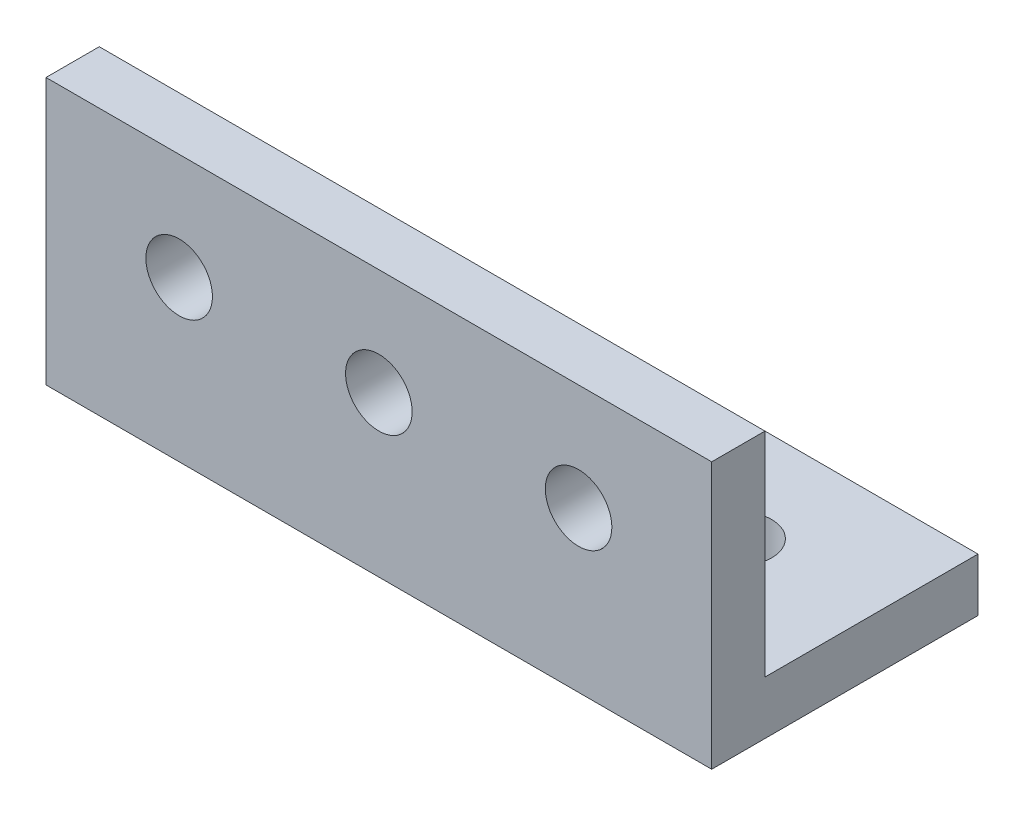
ISO-10303-21;
HEADER;
FILE_DESCRIPTION(('STEP AP214'),'2;1');
FILE_NAME('part.step','',(''),(''),'','','');
FILE_SCHEMA(('AUTOMOTIVE_DESIGN { 1 0 10303 214 1 1 1 1 }'));
ENDSEC;
DATA;
#1=APPLICATION_CONTEXT('core data for automotive mechanical design processes');
#2=APPLICATION_PROTOCOL_DEFINITION('international standard','automotive_design',2000,#1);
#3=PRODUCT_CONTEXT('',#1,'mechanical');
#4=PRODUCT('Part','Part','',(#3));
#5=PRODUCT_RELATED_PRODUCT_CATEGORY('part','',(#4));
#6=PRODUCT_DEFINITION_FORMATION('','',#4);
#7=PRODUCT_DEFINITION_CONTEXT('part definition',#1,'design');
#8=PRODUCT_DEFINITION('design','',#6,#7);
#9=PRODUCT_DEFINITION_SHAPE('','',#8);
#10=(LENGTH_UNIT() NAMED_UNIT(*) SI_UNIT(.MILLI.,.METRE.));
#11=(NAMED_UNIT(*) PLANE_ANGLE_UNIT() SI_UNIT($,.RADIAN.));
#12=(NAMED_UNIT(*) SI_UNIT($,.STERADIAN.) SOLID_ANGLE_UNIT());
#13=UNCERTAINTY_MEASURE_WITH_UNIT(LENGTH_MEASURE(1.E-05),#10,'distance_accuracy_value','');
#14=(GEOMETRIC_REPRESENTATION_CONTEXT(3) GLOBAL_UNCERTAINTY_ASSIGNED_CONTEXT((#13)) GLOBAL_UNIT_ASSIGNED_CONTEXT((#10,
#11,#12)) REPRESENTATION_CONTEXT('',''));
#15=CARTESIAN_POINT('',(0.,0.,0.));
#16=DIRECTION('',(0.,0.,1.));
#17=DIRECTION('',(1.,0.,0.));
#18=AXIS2_PLACEMENT_3D('',#15,#16,#17);
#19=CARTESIAN_POINT('',(0.,4.,0.));
#20=DIRECTION('',(0.,-1.,0.));
#21=DIRECTION('',(0.,0.,-1.));
#22=AXIS2_PLACEMENT_3D('',#19,#20,#21);
#23=PLANE('',#22);
#24=CARTESIAN_POINT('',(25.,4.,-12.));
#25=DIRECTION('',(0.,1.,0.));
#26=DIRECTION('',(0.,0.,1.));
#27=AXIS2_PLACEMENT_3D('',#24,#25,#26);
#28=CIRCLE('',#27,2.5);
#29=CARTESIAN_POINT('',(25.,4.,-9.5));
#30=VERTEX_POINT('',#29);
#31=EDGE_CURVE('E125',#30,#30,#28,.T.);
#32=ORIENTED_EDGE('',*,*,#31,.F.);
#33=EDGE_LOOP('',(#32));
#34=FACE_BOUND('',#33,.T.);
#35=CARTESIAN_POINT('',(40.,4.,-12.));
#36=DIRECTION('',(0.,1.,0.));
#37=DIRECTION('',(0.,0.,1.));
#38=AXIS2_PLACEMENT_3D('',#35,#36,#37);
#39=CIRCLE('',#38,2.5);
#40=CARTESIAN_POINT('',(40.,4.,-9.5));
#41=VERTEX_POINT('',#40);
#42=EDGE_CURVE('E120',#41,#41,#39,.T.);
#43=ORIENTED_EDGE('',*,*,#42,.F.);
#44=EDGE_LOOP('',(#43));
#45=FACE_BOUND('',#44,.T.);
#46=CARTESIAN_POINT('',(10.,4.,-12.));
#47=DIRECTION('',(0.,1.,0.));
#48=DIRECTION('',(0.,0.,1.));
#49=AXIS2_PLACEMENT_3D('',#46,#47,#48);
#50=CIRCLE('',#49,2.5);
#51=CARTESIAN_POINT('',(10.,4.,-9.5));
#52=VERTEX_POINT('',#51);
#53=EDGE_CURVE('E99',#52,#52,#50,.T.);
#54=ORIENTED_EDGE('',*,*,#53,.F.);
#55=EDGE_LOOP('',(#54));
#56=FACE_BOUND('',#55,.T.);
#57=DIRECTION('',(-1.,0.,0.));
#58=VECTOR('',#57,1.);
#59=CARTESIAN_POINT('',(0.,4.,-4.));
#60=LINE('',#59,#58);
#61=CARTESIAN_POINT('',(50.,4.,-4.));
#62=VERTEX_POINT('',#61);
#63=CARTESIAN_POINT('',(0.,4.,-4.));
#64=VERTEX_POINT('',#63);
#65=EDGE_CURVE('E52',#62,#64,#60,.T.);
#66=ORIENTED_EDGE('',*,*,#65,.F.);
#67=DIRECTION('',(0.,0.,-1.));
#68=VECTOR('',#67,1.);
#69=CARTESIAN_POINT('',(50.,4.,0.));
#70=LINE('',#69,#68);
#71=CARTESIAN_POINT('',(50.,4.,-20.));
#72=VERTEX_POINT('',#71);
#73=EDGE_CURVE('E114',#62,#72,#70,.T.);
#74=ORIENTED_EDGE('',*,*,#73,.T.);
#75=DIRECTION('',(-1.,0.,0.));
#76=VECTOR('',#75,1.);
#77=CARTESIAN_POINT('',(0.,4.,-20.));
#78=LINE('',#77,#76);
#79=CARTESIAN_POINT('',(0.,4.,-20.));
#80=VERTEX_POINT('',#79);
#81=EDGE_CURVE('E58',#72,#80,#78,.T.);
#82=ORIENTED_EDGE('',*,*,#81,.T.);
#83=DIRECTION('',(0.,0.,1.));
#84=VECTOR('',#83,1.);
#85=CARTESIAN_POINT('',(0.,4.,0.));
#86=LINE('',#85,#84);
#87=EDGE_CURVE('E87',#80,#64,#86,.T.);
#88=ORIENTED_EDGE('',*,*,#87,.T.);
#89=EDGE_LOOP('',(#66,#74,#82,#88));
#90=FACE_BOUND('',#89,.T.);
#91=ADVANCED_FACE('F35',(#34,#45,#56,#90),#23,.F.);
#92=CARTESIAN_POINT('',(0.,0.,0.));
#93=DIRECTION('',(0.,-1.,0.));
#94=DIRECTION('',(0.,0.,-1.));
#95=AXIS2_PLACEMENT_3D('',#92,#93,#94);
#96=PLANE('',#95);
#97=CARTESIAN_POINT('',(40.,0.,-12.));
#98=DIRECTION('',(0.,1.,0.));
#99=DIRECTION('',(0.,0.,1.));
#100=AXIS2_PLACEMENT_3D('',#97,#98,#99);
#101=CIRCLE('',#100,2.5);
#102=CARTESIAN_POINT('',(40.,0.,-9.5));
#103=VERTEX_POINT('',#102);
#104=EDGE_CURVE('E122',#103,#103,#101,.T.);
#105=ORIENTED_EDGE('',*,*,#104,.T.);
#106=EDGE_LOOP('',(#105));
#107=FACE_BOUND('',#106,.T.);
#108=DIRECTION('',(0.,0.,1.));
#109=VECTOR('',#108,1.);
#110=CARTESIAN_POINT('',(0.,0.,0.));
#111=LINE('',#110,#109);
#112=CARTESIAN_POINT('',(0.,0.,-20.));
#113=VERTEX_POINT('',#112);
#114=CARTESIAN_POINT('',(0.,0.,0.));
#115=VERTEX_POINT('',#114);
#116=EDGE_CURVE('E93',#113,#115,#111,.T.);
#117=ORIENTED_EDGE('',*,*,#116,.F.);
#118=DIRECTION('',(-1.,0.,0.));
#119=VECTOR('',#118,1.);
#120=CARTESIAN_POINT('',(0.,0.,-20.));
#121=LINE('',#120,#119);
#122=CARTESIAN_POINT('',(50.,0.,-20.));
#123=VERTEX_POINT('',#122);
#124=EDGE_CURVE('E77',#123,#113,#121,.T.);
#125=ORIENTED_EDGE('',*,*,#124,.F.);
#126=DIRECTION('',(0.,0.,-1.));
#127=VECTOR('',#126,1.);
#128=CARTESIAN_POINT('',(50.,0.,0.));
#129=LINE('',#128,#127);
#130=CARTESIAN_POINT('',(50.,0.,0.));
#131=VERTEX_POINT('',#130);
#132=EDGE_CURVE('E88',#131,#123,#129,.T.);
#133=ORIENTED_EDGE('',*,*,#132,.F.);
#134=DIRECTION('',(1.,0.,0.));
#135=VECTOR('',#134,1.);
#136=CARTESIAN_POINT('',(0.,0.,0.));
#137=LINE('',#136,#135);
#138=EDGE_CURVE('E98',#115,#131,#137,.T.);
#139=ORIENTED_EDGE('',*,*,#138,.F.);
#140=EDGE_LOOP('',(#117,#125,#133,#139));
#141=FACE_BOUND('',#140,.T.);
#142=CARTESIAN_POINT('',(10.,0.,-12.));
#143=DIRECTION('',(0.,1.,0.));
#144=DIRECTION('',(0.,0.,1.));
#145=AXIS2_PLACEMENT_3D('',#142,#143,#144);
#146=CIRCLE('',#145,2.5);
#147=CARTESIAN_POINT('',(10.,0.,-9.5));
#148=VERTEX_POINT('',#147);
#149=EDGE_CURVE('E103',#148,#148,#146,.T.);
#150=ORIENTED_EDGE('',*,*,#149,.T.);
#151=EDGE_LOOP('',(#150));
#152=FACE_BOUND('',#151,.T.);
#153=CARTESIAN_POINT('',(25.,0.,-12.));
#154=DIRECTION('',(0.,1.,0.));
#155=DIRECTION('',(0.,0.,1.));
#156=AXIS2_PLACEMENT_3D('',#153,#154,#155);
#157=CIRCLE('',#156,2.5);
#158=CARTESIAN_POINT('',(25.,0.,-9.5));
#159=VERTEX_POINT('',#158);
#160=EDGE_CURVE('E128',#159,#159,#157,.T.);
#161=ORIENTED_EDGE('',*,*,#160,.T.);
#162=EDGE_LOOP('',(#161));
#163=FACE_BOUND('',#162,.T.);
#164=ADVANCED_FACE('F96',(#107,#141,#152,#163),#96,.T.);
#165=CARTESIAN_POINT('',(0.,4.,0.));
#166=DIRECTION('',(1.,0.,0.));
#167=DIRECTION('',(0.,0.,-1.));
#168=AXIS2_PLACEMENT_3D('',#165,#166,#167);
#169=PLANE('',#168);
#170=ORIENTED_EDGE('',*,*,#116,.T.);
#171=DIRECTION('',(0.,-1.,0.));
#172=VECTOR('',#171,1.);
#173=CARTESIAN_POINT('',(0.,4.,0.));
#174=LINE('',#173,#172);
#175=CARTESIAN_POINT('',(0.,20.,0.));
#176=VERTEX_POINT('',#175);
#177=EDGE_CURVE('E11',#176,#115,#174,.T.);
#178=ORIENTED_EDGE('',*,*,#177,.F.);
#179=DIRECTION('',(0.,0.,1.));
#180=VECTOR('',#179,1.);
#181=CARTESIAN_POINT('',(0.,20.,0.));
#182=LINE('',#181,#180);
#183=CARTESIAN_POINT('',(0.,20.,-4.));
#184=VERTEX_POINT('',#183);
#185=EDGE_CURVE('E139',#184,#176,#182,.T.);
#186=ORIENTED_EDGE('',*,*,#185,.F.);
#187=DIRECTION('',(0.,-1.,0.));
#188=VECTOR('',#187,1.);
#189=CARTESIAN_POINT('',(0.,20.,-4.));
#190=LINE('',#189,#188);
#191=EDGE_CURVE('E141',#184,#64,#190,.T.);
#192=ORIENTED_EDGE('',*,*,#191,.T.);
#193=ORIENTED_EDGE('',*,*,#87,.F.);
#194=DIRECTION('',(0.,-1.,0.));
#195=VECTOR('',#194,1.);
#196=CARTESIAN_POINT('',(0.,4.,-20.));
#197=LINE('',#196,#195);
#198=EDGE_CURVE('E80',#80,#113,#197,.T.);
#199=ORIENTED_EDGE('',*,*,#198,.T.);
#200=EDGE_LOOP('',(#170,#178,#186,#192,#193,#199));
#201=FACE_BOUND('',#200,.T.);
#202=ADVANCED_FACE('F37',(#201),#169,.F.);
#203=CARTESIAN_POINT('',(0.,4.,0.));
#204=DIRECTION('',(0.,0.,-1.));
#205=DIRECTION('',(-1.,0.,0.));
#206=AXIS2_PLACEMENT_3D('',#203,#204,#205);
#207=PLANE('',#206);
#208=CARTESIAN_POINT('',(25.,12.,0.));
#209=DIRECTION('',(0.,0.,1.));
#210=DIRECTION('',(1.,0.,0.));
#211=AXIS2_PLACEMENT_3D('',#208,#209,#210);
#212=CIRCLE('',#211,2.5);
#213=CARTESIAN_POINT('',(27.5,12.,0.));
#214=VERTEX_POINT('',#213);
#215=EDGE_CURVE('E189',#214,#214,#212,.T.);
#216=ORIENTED_EDGE('',*,*,#215,.F.);
#217=EDGE_LOOP('',(#216));
#218=FACE_BOUND('',#217,.T.);
#219=CARTESIAN_POINT('',(40.,12.,0.));
#220=DIRECTION('',(0.,0.,1.));
#221=DIRECTION('',(1.,0.,0.));
#222=AXIS2_PLACEMENT_3D('',#219,#220,#221);
#223=CIRCLE('',#222,2.5);
#224=CARTESIAN_POINT('',(42.5,12.,0.));
#225=VERTEX_POINT('',#224);
#226=EDGE_CURVE('E183',#225,#225,#223,.T.);
#227=ORIENTED_EDGE('',*,*,#226,.F.);
#228=EDGE_LOOP('',(#227));
#229=FACE_BOUND('',#228,.T.);
#230=CARTESIAN_POINT('',(10.,12.,0.));
#231=DIRECTION('',(0.,0.,1.));
#232=DIRECTION('',(1.,0.,0.));
#233=AXIS2_PLACEMENT_3D('',#230,#231,#232);
#234=CIRCLE('',#233,2.5);
#235=CARTESIAN_POINT('',(12.5,12.,0.));
#236=VERTEX_POINT('',#235);
#237=EDGE_CURVE('E177',#236,#236,#234,.T.);
#238=ORIENTED_EDGE('',*,*,#237,.F.);
#239=EDGE_LOOP('',(#238));
#240=FACE_BOUND('',#239,.T.);
#241=ORIENTED_EDGE('',*,*,#138,.T.);
#242=DIRECTION('',(0.,-1.,0.));
#243=VECTOR('',#242,1.);
#244=CARTESIAN_POINT('',(50.,4.,0.));
#245=LINE('',#244,#243);
#246=CARTESIAN_POINT('',(50.,20.,0.));
#247=VERTEX_POINT('',#246);
#248=EDGE_CURVE('E44',#247,#131,#245,.T.);
#249=ORIENTED_EDGE('',*,*,#248,.F.);
#250=DIRECTION('',(1.,0.,0.));
#251=VECTOR('',#250,1.);
#252=CARTESIAN_POINT('',(0.,20.,0.));
#253=LINE('',#252,#251);
#254=EDGE_CURVE('E171',#176,#247,#253,.T.);
#255=ORIENTED_EDGE('',*,*,#254,.F.);
#256=ORIENTED_EDGE('',*,*,#177,.T.);
#257=EDGE_LOOP('',(#241,#249,#255,#256));
#258=FACE_BOUND('',#257,.T.);
#259=ADVANCED_FACE('F172',(#218,#229,#240,#258),#207,.F.);
#260=CARTESIAN_POINT('',(50.,4.,0.));
#261=DIRECTION('',(-1.,0.,0.));
#262=DIRECTION('',(0.,0.,1.));
#263=AXIS2_PLACEMENT_3D('',#260,#261,#262);
#264=PLANE('',#263);
#265=ORIENTED_EDGE('',*,*,#132,.T.);
#266=DIRECTION('',(0.,-1.,0.));
#267=VECTOR('',#266,1.);
#268=CARTESIAN_POINT('',(50.,4.,-20.));
#269=LINE('',#268,#267);
#270=EDGE_CURVE('E83',#72,#123,#269,.T.);
#271=ORIENTED_EDGE('',*,*,#270,.F.);
#272=ORIENTED_EDGE('',*,*,#73,.F.);
#273=DIRECTION('',(0.,-1.,0.));
#274=VECTOR('',#273,1.);
#275=CARTESIAN_POINT('',(50.,20.,-4.));
#276=LINE('',#275,#274);
#277=CARTESIAN_POINT('',(50.,20.,-4.));
#278=VERTEX_POINT('',#277);
#279=EDGE_CURVE('E131',#278,#62,#276,.T.);
#280=ORIENTED_EDGE('',*,*,#279,.F.);
#281=DIRECTION('',(0.,0.,-1.));
#282=VECTOR('',#281,1.);
#283=CARTESIAN_POINT('',(50.,20.,0.));
#284=LINE('',#283,#282);
#285=EDGE_CURVE('E158',#247,#278,#284,.T.);
#286=ORIENTED_EDGE('',*,*,#285,.F.);
#287=ORIENTED_EDGE('',*,*,#248,.T.);
#288=EDGE_LOOP('',(#265,#271,#272,#280,#286,#287));
#289=FACE_BOUND('',#288,.T.);
#290=ADVANCED_FACE('F155',(#289),#264,.F.);
#291=CARTESIAN_POINT('',(0.,4.,-20.));
#292=DIRECTION('',(0.,0.,1.));
#293=DIRECTION('',(1.,0.,0.));
#294=AXIS2_PLACEMENT_3D('',#291,#292,#293);
#295=PLANE('',#294);
#296=ORIENTED_EDGE('',*,*,#124,.T.);
#297=ORIENTED_EDGE('',*,*,#198,.F.);
#298=ORIENTED_EDGE('',*,*,#81,.F.);
#299=ORIENTED_EDGE('',*,*,#270,.T.);
#300=EDGE_LOOP('',(#296,#297,#298,#299));
#301=FACE_BOUND('',#300,.T.);
#302=ADVANCED_FACE('F79',(#301),#295,.F.);
#303=CARTESIAN_POINT('',(10.,4.,-12.));
#304=DIRECTION('',(0.,-1.,0.));
#305=DIRECTION('',(0.,0.,-1.));
#306=AXIS2_PLACEMENT_3D('',#303,#304,#305);
#307=CYLINDRICAL_SURFACE('',#306,2.5);
#308=ORIENTED_EDGE('',*,*,#53,.T.);
#309=EDGE_LOOP('',(#308));
#310=FACE_BOUND('',#309,.T.);
#311=ORIENTED_EDGE('',*,*,#149,.F.);
#312=EDGE_LOOP('',(#311));
#313=FACE_BOUND('',#312,.T.);
#314=ADVANCED_FACE('F233',(#310,#313),#307,.F.);
#315=CARTESIAN_POINT('',(40.,4.,-12.));
#316=DIRECTION('',(0.,-1.,0.));
#317=DIRECTION('',(0.,0.,-1.));
#318=AXIS2_PLACEMENT_3D('',#315,#316,#317);
#319=CYLINDRICAL_SURFACE('',#318,2.5);
#320=ORIENTED_EDGE('',*,*,#42,.T.);
#321=EDGE_LOOP('',(#320));
#322=FACE_BOUND('',#321,.T.);
#323=ORIENTED_EDGE('',*,*,#104,.F.);
#324=EDGE_LOOP('',(#323));
#325=FACE_BOUND('',#324,.T.);
#326=ADVANCED_FACE('F257',(#322,#325),#319,.F.);
#327=CARTESIAN_POINT('',(25.,4.,-12.));
#328=DIRECTION('',(0.,-1.,0.));
#329=DIRECTION('',(0.,0.,-1.));
#330=AXIS2_PLACEMENT_3D('',#327,#328,#329);
#331=CYLINDRICAL_SURFACE('',#330,2.5);
#332=ORIENTED_EDGE('',*,*,#31,.T.);
#333=EDGE_LOOP('',(#332));
#334=FACE_BOUND('',#333,.T.);
#335=ORIENTED_EDGE('',*,*,#160,.F.);
#336=EDGE_LOOP('',(#335));
#337=FACE_BOUND('',#336,.T.);
#338=ADVANCED_FACE('F264',(#334,#337),#331,.F.);
#339=CARTESIAN_POINT('',(0.,20.,-4.));
#340=DIRECTION('',(0.,0.,1.));
#341=DIRECTION('',(1.,0.,0.));
#342=AXIS2_PLACEMENT_3D('',#339,#340,#341);
#343=PLANE('',#342);
#344=CARTESIAN_POINT('',(25.,12.,-4.));
#345=DIRECTION('',(0.,0.,1.));
#346=DIRECTION('',(1.,0.,0.));
#347=AXIS2_PLACEMENT_3D('',#344,#345,#346);
#348=CIRCLE('',#347,2.5);
#349=CARTESIAN_POINT('',(27.5,12.,-4.));
#350=VERTEX_POINT('',#349);
#351=EDGE_CURVE('E186',#350,#350,#348,.T.);
#352=ORIENTED_EDGE('',*,*,#351,.T.);
#353=EDGE_LOOP('',(#352));
#354=FACE_BOUND('',#353,.T.);
#355=CARTESIAN_POINT('',(40.,12.,-4.));
#356=DIRECTION('',(0.,0.,1.));
#357=DIRECTION('',(1.,0.,0.));
#358=AXIS2_PLACEMENT_3D('',#355,#356,#357);
#359=CIRCLE('',#358,2.5);
#360=CARTESIAN_POINT('',(42.5,12.,-4.));
#361=VERTEX_POINT('',#360);
#362=EDGE_CURVE('E180',#361,#361,#359,.T.);
#363=ORIENTED_EDGE('',*,*,#362,.T.);
#364=EDGE_LOOP('',(#363));
#365=FACE_BOUND('',#364,.T.);
#366=CARTESIAN_POINT('',(10.,12.,-4.));
#367=DIRECTION('',(0.,0.,1.));
#368=DIRECTION('',(1.,0.,0.));
#369=AXIS2_PLACEMENT_3D('',#366,#367,#368);
#370=CIRCLE('',#369,2.5);
#371=CARTESIAN_POINT('',(12.5,12.,-4.));
#372=VERTEX_POINT('',#371);
#373=EDGE_CURVE('E140',#372,#372,#370,.T.);
#374=ORIENTED_EDGE('',*,*,#373,.T.);
#375=EDGE_LOOP('',(#374));
#376=FACE_BOUND('',#375,.T.);
#377=ORIENTED_EDGE('',*,*,#65,.T.);
#378=ORIENTED_EDGE('',*,*,#191,.F.);
#379=DIRECTION('',(-1.,0.,0.));
#380=VECTOR('',#379,1.);
#381=CARTESIAN_POINT('',(0.,20.,-4.));
#382=LINE('',#381,#380);
#383=EDGE_CURVE('E136',#278,#184,#382,.T.);
#384=ORIENTED_EDGE('',*,*,#383,.F.);
#385=ORIENTED_EDGE('',*,*,#279,.T.);
#386=EDGE_LOOP('',(#377,#378,#384,#385));
#387=FACE_BOUND('',#386,.T.);
#388=ADVANCED_FACE('F148',(#354,#365,#376,#387),#343,.F.);
#389=CARTESIAN_POINT('',(0.,20.,0.));
#390=DIRECTION('',(0.,-1.,0.));
#391=DIRECTION('',(0.,0.,-1.));
#392=AXIS2_PLACEMENT_3D('',#389,#390,#391);
#393=PLANE('',#392);
#394=ORIENTED_EDGE('',*,*,#185,.T.);
#395=ORIENTED_EDGE('',*,*,#254,.T.);
#396=ORIENTED_EDGE('',*,*,#285,.T.);
#397=ORIENTED_EDGE('',*,*,#383,.T.);
#398=EDGE_LOOP('',(#394,#395,#396,#397));
#399=FACE_BOUND('',#398,.T.);
#400=ADVANCED_FACE('F174',(#399),#393,.F.);
#401=CARTESIAN_POINT('',(10.,12.,-4.));
#402=DIRECTION('',(0.,0.,1.));
#403=DIRECTION('',(1.,0.,0.));
#404=AXIS2_PLACEMENT_3D('',#401,#402,#403);
#405=CYLINDRICAL_SURFACE('',#404,2.5);
#406=ORIENTED_EDGE('',*,*,#373,.F.);
#407=EDGE_LOOP('',(#406));
#408=FACE_BOUND('',#407,.T.);
#409=ORIENTED_EDGE('',*,*,#237,.T.);
#410=EDGE_LOOP('',(#409));
#411=FACE_BOUND('',#410,.T.);
#412=ADVANCED_FACE('F210',(#408,#411),#405,.F.);
#413=CARTESIAN_POINT('',(40.,12.,-4.));
#414=DIRECTION('',(0.,0.,1.));
#415=DIRECTION('',(1.,0.,0.));
#416=AXIS2_PLACEMENT_3D('',#413,#414,#415);
#417=CYLINDRICAL_SURFACE('',#416,2.5);
#418=ORIENTED_EDGE('',*,*,#362,.F.);
#419=EDGE_LOOP('',(#418));
#420=FACE_BOUND('',#419,.T.);
#421=ORIENTED_EDGE('',*,*,#226,.T.);
#422=EDGE_LOOP('',(#421));
#423=FACE_BOUND('',#422,.T.);
#424=ADVANCED_FACE('F200',(#420,#423),#417,.F.);
#425=CARTESIAN_POINT('',(25.,12.,-4.));
#426=DIRECTION('',(0.,0.,1.));
#427=DIRECTION('',(1.,0.,0.));
#428=AXIS2_PLACEMENT_3D('',#425,#426,#427);
#429=CYLINDRICAL_SURFACE('',#428,2.5);
#430=ORIENTED_EDGE('',*,*,#351,.F.);
#431=EDGE_LOOP('',(#430));
#432=FACE_BOUND('',#431,.T.);
#433=ORIENTED_EDGE('',*,*,#215,.T.);
#434=EDGE_LOOP('',(#433));
#435=FACE_BOUND('',#434,.T.);
#436=ADVANCED_FACE('F197',(#432,#435),#429,.F.);
#437=CLOSED_SHELL('',(#91,#164,#202,#259,#290,#302,#314,#326,#338,#388,#400,#412,#424,#436));
#438=MANIFOLD_SOLID_BREP('B2',#437);
#439=ADVANCED_BREP_SHAPE_REPRESENTATION('',(#18,#438),#14);
#440=SHAPE_DEFINITION_REPRESENTATION(#9,#439);
ENDSEC;
END-ISO-10303-21;
